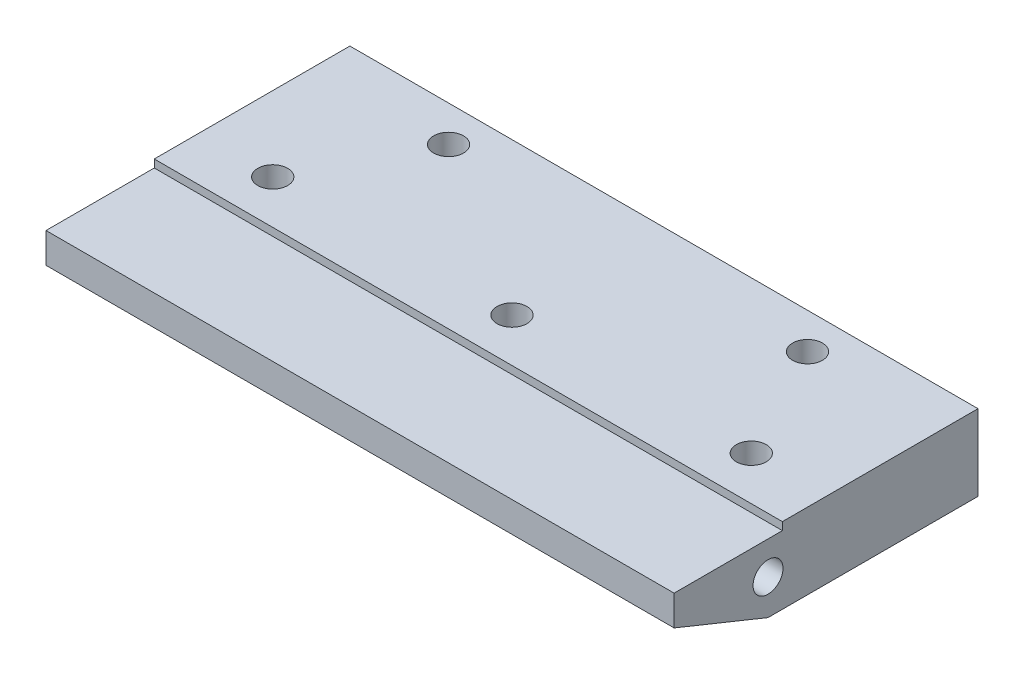
ISO-10303-21;
HEADER;
FILE_DESCRIPTION(('STEP AP214'),'2;1');
FILE_NAME('part.step','',(''),(''),'','','');
FILE_SCHEMA(('AUTOMOTIVE_DESIGN { 1 0 10303 214 1 1 1 1 }'));
ENDSEC;
DATA;
#1=APPLICATION_CONTEXT('core data for automotive mechanical design processes');
#2=APPLICATION_PROTOCOL_DEFINITION('international standard','automotive_design',2000,#1);
#3=PRODUCT_CONTEXT('',#1,'mechanical');
#4=PRODUCT('Part','Part','',(#3));
#5=PRODUCT_RELATED_PRODUCT_CATEGORY('part','',(#4));
#6=PRODUCT_DEFINITION_FORMATION('','',#4);
#7=PRODUCT_DEFINITION_CONTEXT('part definition',#1,'design');
#8=PRODUCT_DEFINITION('design','',#6,#7);
#9=PRODUCT_DEFINITION_SHAPE('','',#8);
#10=(LENGTH_UNIT() NAMED_UNIT(*) SI_UNIT(.MILLI.,.METRE.));
#11=(NAMED_UNIT(*) PLANE_ANGLE_UNIT() SI_UNIT($,.RADIAN.));
#12=(NAMED_UNIT(*) SI_UNIT($,.STERADIAN.) SOLID_ANGLE_UNIT());
#13=UNCERTAINTY_MEASURE_WITH_UNIT(LENGTH_MEASURE(1.E-05),#10,'distance_accuracy_value','');
#14=(GEOMETRIC_REPRESENTATION_CONTEXT(3) GLOBAL_UNCERTAINTY_ASSIGNED_CONTEXT((#13)) GLOBAL_UNIT_ASSIGNED_CONTEXT((#10,
#11,#12)) REPRESENTATION_CONTEXT('',''));
#15=CARTESIAN_POINT('',(0.,0.,0.));
#16=DIRECTION('',(0.,0.,1.));
#17=DIRECTION('',(1.,0.,0.));
#18=AXIS2_PLACEMENT_3D('',#15,#16,#17);
#19=CARTESIAN_POINT('',(-52.5,12.7,25.4));
#20=DIRECTION('',(1.,0.,0.));
#21=DIRECTION('',(0.,0.,-1.));
#22=AXIS2_PLACEMENT_3D('',#19,#20,#21);
#23=PLANE('',#22);
#24=CARTESIAN_POINT('',(-52.5,5.89001188077765,9.7010314887358));
#25=DIRECTION('',(1.,0.,0.));
#26=DIRECTION('',(0.,0.,-1.));
#27=AXIS2_PLACEMENT_3D('',#24,#25,#26);
#28=CIRCLE('',#27,2.5);
#29=CARTESIAN_POINT('',(-52.5,5.89001188077765,7.2010314887358));
#30=VERTEX_POINT('',#29);
#31=EDGE_CURVE('E200',#30,#30,#28,.T.);
#32=ORIENTED_EDGE('',*,*,#31,.T.);
#33=EDGE_LOOP('',(#32));
#34=FACE_BOUND('',#33,.T.);
#35=DIRECTION('',(0.,0.,-1.));
#36=VECTOR('',#35,1.);
#37=CARTESIAN_POINT('',(-52.5,11.394536374143,25.4));
#38=LINE('',#37,#36);
#39=CARTESIAN_POINT('',(-52.5,11.394536374143,25.4));
#40=VERTEX_POINT('',#39);
#41=CARTESIAN_POINT('',(-52.5,11.394536374143,7.3022309751575));
#42=VERTEX_POINT('',#41);
#43=EDGE_CURVE('E90',#40,#42,#38,.T.);
#44=ORIENTED_EDGE('',*,*,#43,.T.);
#45=DIRECTION('',(0.,1.,0.));
#46=VECTOR('',#45,1.);
#47=CARTESIAN_POINT('',(-52.5,12.7,7.3022309751575));
#48=LINE('',#47,#46);
#49=CARTESIAN_POINT('',(-52.5,12.7,7.3022309751575));
#50=VERTEX_POINT('',#49);
#51=EDGE_CURVE('E101',#42,#50,#48,.T.);
#52=ORIENTED_EDGE('',*,*,#51,.T.);
#53=DIRECTION('',(0.,0.,1.));
#54=VECTOR('',#53,1.);
#55=CARTESIAN_POINT('',(-52.5,12.7,25.4));
#56=LINE('',#55,#54);
#57=CARTESIAN_POINT('',(-52.5,12.7,-25.4));
#58=VERTEX_POINT('',#57);
#59=EDGE_CURVE('E123',#58,#50,#56,.T.);
#60=ORIENTED_EDGE('',*,*,#59,.F.);
#61=DIRECTION('',(0.,-1.,0.));
#62=VECTOR('',#61,1.);
#63=CARTESIAN_POINT('',(-52.5,12.7,-25.4));
#64=LINE('',#63,#62);
#65=CARTESIAN_POINT('',(-52.5,0.,-25.4));
#66=VERTEX_POINT('',#65);
#67=EDGE_CURVE('E131',#58,#66,#64,.T.);
#68=ORIENTED_EDGE('',*,*,#67,.T.);
#69=DIRECTION('',(0.,0.,1.));
#70=VECTOR('',#69,1.);
#71=CARTESIAN_POINT('',(-52.5,0.,25.4));
#72=LINE('',#71,#70);
#73=CARTESIAN_POINT('',(-52.5,0.,9.7010314887358));
#74=VERTEX_POINT('',#73);
#75=EDGE_CURVE('E111',#66,#74,#72,.T.);
#76=ORIENTED_EDGE('',*,*,#75,.T.);
#77=DIRECTION('',(0.,0.374972320189401,0.927036007440799));
#78=VECTOR('',#77,1.);
#79=CARTESIAN_POINT('',(-52.5,6.35,25.4));
#80=LINE('',#79,#78);
#81=CARTESIAN_POINT('',(-52.5,6.35,25.4));
#82=VERTEX_POINT('',#81);
#83=EDGE_CURVE('E55',#74,#82,#80,.T.);
#84=ORIENTED_EDGE('',*,*,#83,.T.);
#85=DIRECTION('',(0.,-1.,0.));
#86=VECTOR('',#85,1.);
#87=CARTESIAN_POINT('',(-52.5,12.7,25.4));
#88=LINE('',#87,#86);
#89=EDGE_CURVE('E11',#40,#82,#88,.T.);
#90=ORIENTED_EDGE('',*,*,#89,.F.);
#91=EDGE_LOOP('',(#44,#52,#60,#68,#76,#84,#90));
#92=FACE_BOUND('',#91,.T.);
#93=ADVANCED_FACE('F33',(#34,#92),#23,.F.);
#94=CARTESIAN_POINT('',(52.5,12.7,25.4));
#95=DIRECTION('',(0.,0.,-1.));
#96=DIRECTION('',(-1.,0.,0.));
#97=AXIS2_PLACEMENT_3D('',#94,#95,#96);
#98=PLANE('',#97);
#99=DIRECTION('',(0.,-1.,0.));
#100=VECTOR('',#99,1.);
#101=CARTESIAN_POINT('',(52.5,12.7,25.4));
#102=LINE('',#101,#100);
#103=CARTESIAN_POINT('',(52.5,11.394536374143,25.4));
#104=VERTEX_POINT('',#103);
#105=CARTESIAN_POINT('',(52.5,6.35,25.4));
#106=VERTEX_POINT('',#105);
#107=EDGE_CURVE('E40',#104,#106,#102,.T.);
#108=ORIENTED_EDGE('',*,*,#107,.F.);
#109=DIRECTION('',(1.,0.,0.));
#110=VECTOR('',#109,1.);
#111=CARTESIAN_POINT('',(-52.5,11.394536374143,25.4));
#112=LINE('',#111,#110);
#113=EDGE_CURVE('E94',#40,#104,#112,.T.);
#114=ORIENTED_EDGE('',*,*,#113,.F.);
#115=ORIENTED_EDGE('',*,*,#89,.T.);
#116=DIRECTION('',(1.,0.,0.));
#117=VECTOR('',#116,1.);
#118=CARTESIAN_POINT('',(-52.5,6.35,25.4));
#119=LINE('',#118,#117);
#120=EDGE_CURVE('E115',#82,#106,#119,.T.);
#121=ORIENTED_EDGE('',*,*,#120,.T.);
#122=EDGE_LOOP('',(#108,#114,#115,#121));
#123=FACE_BOUND('',#122,.T.);
#124=ADVANCED_FACE('F105',(#123),#98,.F.);
#125=CARTESIAN_POINT('',(52.5,12.7,25.4));
#126=DIRECTION('',(-1.,0.,0.));
#127=DIRECTION('',(0.,0.,1.));
#128=AXIS2_PLACEMENT_3D('',#125,#126,#127);
#129=PLANE('',#128);
#130=CARTESIAN_POINT('',(52.5,5.89001188077765,9.7010314887358));
#131=DIRECTION('',(1.,0.,0.));
#132=DIRECTION('',(0.,0.,-1.));
#133=AXIS2_PLACEMENT_3D('',#130,#131,#132);
#134=CIRCLE('',#133,2.5);
#135=CARTESIAN_POINT('',(52.5,5.89001188077765,7.2010314887358));
#136=VERTEX_POINT('',#135);
#137=EDGE_CURVE('E194',#136,#136,#134,.T.);
#138=ORIENTED_EDGE('',*,*,#137,.F.);
#139=EDGE_LOOP('',(#138));
#140=FACE_BOUND('',#139,.T.);
#141=DIRECTION('',(0.,0.,-1.));
#142=VECTOR('',#141,1.);
#143=CARTESIAN_POINT('',(52.5,12.7,25.4));
#144=LINE('',#143,#142);
#145=CARTESIAN_POINT('',(52.5,12.7,7.3022309751575));
#146=VERTEX_POINT('',#145);
#147=CARTESIAN_POINT('',(52.5,12.7,-25.4));
#148=VERTEX_POINT('',#147);
#149=EDGE_CURVE('E126',#146,#148,#144,.T.);
#150=ORIENTED_EDGE('',*,*,#149,.F.);
#151=DIRECTION('',(0.,1.,0.));
#152=VECTOR('',#151,1.);
#153=CARTESIAN_POINT('',(52.5,12.7,7.3022309751575));
#154=LINE('',#153,#152);
#155=CARTESIAN_POINT('',(52.5,11.394536374143,7.3022309751575));
#156=VERTEX_POINT('',#155);
#157=EDGE_CURVE('E47',#156,#146,#154,.T.);
#158=ORIENTED_EDGE('',*,*,#157,.F.);
#159=DIRECTION('',(0.,0.,-1.));
#160=VECTOR('',#159,1.);
#161=CARTESIAN_POINT('',(52.5,11.394536374143,25.4));
#162=LINE('',#161,#160);
#163=EDGE_CURVE('E144',#104,#156,#162,.T.);
#164=ORIENTED_EDGE('',*,*,#163,.F.);
#165=ORIENTED_EDGE('',*,*,#107,.T.);
#166=DIRECTION('',(0.,0.374972320189401,0.927036007440799));
#167=VECTOR('',#166,1.);
#168=CARTESIAN_POINT('',(52.5,6.35,25.4));
#169=LINE('',#168,#167);
#170=CARTESIAN_POINT('',(52.5,0.,9.7010314887358));
#171=VERTEX_POINT('',#170);
#172=EDGE_CURVE('E113',#171,#106,#169,.T.);
#173=ORIENTED_EDGE('',*,*,#172,.F.);
#174=DIRECTION('',(0.,0.,-1.));
#175=VECTOR('',#174,1.);
#176=CARTESIAN_POINT('',(52.5,0.,25.4));
#177=LINE('',#176,#175);
#178=CARTESIAN_POINT('',(52.5,0.,-25.4));
#179=VERTEX_POINT('',#178);
#180=EDGE_CURVE('E133',#171,#179,#177,.T.);
#181=ORIENTED_EDGE('',*,*,#180,.T.);
#182=DIRECTION('',(0.,-1.,0.));
#183=VECTOR('',#182,1.);
#184=CARTESIAN_POINT('',(52.5,12.7,-25.4));
#185=LINE('',#184,#183);
#186=EDGE_CURVE('E137',#148,#179,#185,.T.);
#187=ORIENTED_EDGE('',*,*,#186,.F.);
#188=EDGE_LOOP('',(#150,#158,#164,#165,#173,#181,#187));
#189=FACE_BOUND('',#188,.T.);
#190=ADVANCED_FACE('F142',(#140,#189),#129,.F.);
#191=CARTESIAN_POINT('',(52.5,12.7,-25.4));
#192=DIRECTION('',(0.,0.,1.));
#193=DIRECTION('',(1.,0.,0.));
#194=AXIS2_PLACEMENT_3D('',#191,#192,#193);
#195=PLANE('',#194);
#196=DIRECTION('',(-1.,0.,0.));
#197=VECTOR('',#196,1.);
#198=CARTESIAN_POINT('',(52.5,0.,-25.4));
#199=LINE('',#198,#197);
#200=EDGE_CURVE('E127',#179,#66,#199,.T.);
#201=ORIENTED_EDGE('',*,*,#200,.T.);
#202=ORIENTED_EDGE('',*,*,#67,.F.);
#203=DIRECTION('',(-1.,0.,0.));
#204=VECTOR('',#203,1.);
#205=CARTESIAN_POINT('',(52.5,12.7,-25.4));
#206=LINE('',#205,#204);
#207=EDGE_CURVE('E129',#148,#58,#206,.T.);
#208=ORIENTED_EDGE('',*,*,#207,.F.);
#209=ORIENTED_EDGE('',*,*,#186,.T.);
#210=EDGE_LOOP('',(#201,#202,#208,#209));
#211=FACE_BOUND('',#210,.T.);
#212=ADVANCED_FACE('F152',(#211),#195,.F.);
#213=CARTESIAN_POINT('',(0.,12.7,0.));
#214=DIRECTION('',(0.,1.,0.));
#215=DIRECTION('',(0.,0.,1.));
#216=AXIS2_PLACEMENT_3D('',#213,#214,#215);
#217=PLANE('',#216);
#218=CARTESIAN_POINT('',(30.,12.7,-19.4));
#219=DIRECTION('',(0.,1.,0.));
#220=DIRECTION('',(0.,0.,1.));
#221=AXIS2_PLACEMENT_3D('',#218,#219,#220);
#222=CIRCLE('',#221,2.49999999999999);
#223=CARTESIAN_POINT('',(30.,12.7,-16.9));
#224=VERTEX_POINT('',#223);
#225=EDGE_CURVE('E188',#224,#224,#222,.T.);
#226=ORIENTED_EDGE('',*,*,#225,.F.);
#227=EDGE_LOOP('',(#226));
#228=FACE_BOUND('',#227,.T.);
#229=CARTESIAN_POINT('',(-30.,12.7,-19.4));
#230=DIRECTION('',(0.,1.,0.));
#231=DIRECTION('',(0.,0.,1.));
#232=AXIS2_PLACEMENT_3D('',#229,#230,#231);
#233=CIRCLE('',#232,2.5);
#234=CARTESIAN_POINT('',(-30.,12.7,-16.9));
#235=VERTEX_POINT('',#234);
#236=EDGE_CURVE('E182',#235,#235,#233,.T.);
#237=ORIENTED_EDGE('',*,*,#236,.F.);
#238=EDGE_LOOP('',(#237));
#239=FACE_BOUND('',#238,.T.);
#240=CARTESIAN_POINT('',(-40.,12.7,0.));
#241=DIRECTION('',(0.,1.,0.));
#242=DIRECTION('',(0.,0.,1.));
#243=AXIS2_PLACEMENT_3D('',#240,#241,#242);
#244=CIRCLE('',#243,2.5);
#245=CARTESIAN_POINT('',(-40.,12.7,2.5));
#246=VERTEX_POINT('',#245);
#247=EDGE_CURVE('E177',#246,#246,#244,.T.);
#248=ORIENTED_EDGE('',*,*,#247,.F.);
#249=EDGE_LOOP('',(#248));
#250=FACE_BOUND('',#249,.T.);
#251=CARTESIAN_POINT('',(40.,12.7,0.));
#252=DIRECTION('',(0.,1.,0.));
#253=DIRECTION('',(0.,0.,1.));
#254=AXIS2_PLACEMENT_3D('',#251,#252,#253);
#255=CIRCLE('',#254,2.5);
#256=CARTESIAN_POINT('',(40.,12.7,2.5));
#257=VERTEX_POINT('',#256);
#258=EDGE_CURVE('E170',#257,#257,#255,.T.);
#259=ORIENTED_EDGE('',*,*,#258,.F.);
#260=EDGE_LOOP('',(#259));
#261=FACE_BOUND('',#260,.T.);
#262=CARTESIAN_POINT('',(0.,12.7,0.));
#263=DIRECTION('',(0.,1.,0.));
#264=DIRECTION('',(0.,0.,1.));
#265=AXIS2_PLACEMENT_3D('',#262,#263,#264);
#266=CIRCLE('',#265,2.5);
#267=CARTESIAN_POINT('',(0.,12.7,2.5));
#268=VERTEX_POINT('',#267);
#269=EDGE_CURVE('E164',#268,#268,#266,.T.);
#270=ORIENTED_EDGE('',*,*,#269,.F.);
#271=EDGE_LOOP('',(#270));
#272=FACE_BOUND('',#271,.T.);
#273=DIRECTION('',(1.,0.,0.));
#274=VECTOR('',#273,1.);
#275=CARTESIAN_POINT('',(-52.5,12.7,7.3022309751575));
#276=LINE('',#275,#274);
#277=EDGE_CURVE('E118',#50,#146,#276,.T.);
#278=ORIENTED_EDGE('',*,*,#277,.T.);
#279=ORIENTED_EDGE('',*,*,#149,.T.);
#280=ORIENTED_EDGE('',*,*,#207,.T.);
#281=ORIENTED_EDGE('',*,*,#59,.T.);
#282=EDGE_LOOP('',(#278,#279,#280,#281));
#283=FACE_BOUND('',#282,.T.);
#284=ADVANCED_FACE('F156',(#228,#239,#250,#261,#272,#283),#217,.T.);
#285=CARTESIAN_POINT('',(0.,0.,0.));
#286=DIRECTION('',(0.,1.,0.));
#287=DIRECTION('',(0.,0.,1.));
#288=AXIS2_PLACEMENT_3D('',#285,#286,#287);
#289=PLANE('',#288);
#290=CARTESIAN_POINT('',(30.,0.,-19.4));
#291=DIRECTION('',(0.,1.,0.));
#292=DIRECTION('',(0.,0.,1.));
#293=AXIS2_PLACEMENT_3D('',#290,#291,#292);
#294=CIRCLE('',#293,2.49999999999999);
#295=CARTESIAN_POINT('',(30.,0.,-16.9));
#296=VERTEX_POINT('',#295);
#297=EDGE_CURVE('E185',#296,#296,#294,.T.);
#298=ORIENTED_EDGE('',*,*,#297,.T.);
#299=EDGE_LOOP('',(#298));
#300=FACE_BOUND('',#299,.T.);
#301=CARTESIAN_POINT('',(-30.,0.,-19.4));
#302=DIRECTION('',(0.,1.,0.));
#303=DIRECTION('',(0.,0.,1.));
#304=AXIS2_PLACEMENT_3D('',#301,#302,#303);
#305=CIRCLE('',#304,2.5);
#306=CARTESIAN_POINT('',(-30.,0.,-16.9));
#307=VERTEX_POINT('',#306);
#308=EDGE_CURVE('E174',#307,#307,#305,.T.);
#309=ORIENTED_EDGE('',*,*,#308,.T.);
#310=EDGE_LOOP('',(#309));
#311=FACE_BOUND('',#310,.T.);
#312=CARTESIAN_POINT('',(-40.,0.,0.));
#313=DIRECTION('',(0.,1.,0.));
#314=DIRECTION('',(0.,0.,1.));
#315=AXIS2_PLACEMENT_3D('',#312,#313,#314);
#316=CIRCLE('',#315,2.5);
#317=CARTESIAN_POINT('',(-40.,0.,2.5));
#318=VERTEX_POINT('',#317);
#319=EDGE_CURVE('E167',#318,#318,#316,.T.);
#320=ORIENTED_EDGE('',*,*,#319,.T.);
#321=EDGE_LOOP('',(#320));
#322=FACE_BOUND('',#321,.T.);
#323=CARTESIAN_POINT('',(40.,0.,0.));
#324=DIRECTION('',(0.,1.,0.));
#325=DIRECTION('',(0.,0.,1.));
#326=AXIS2_PLACEMENT_3D('',#323,#324,#325);
#327=CIRCLE('',#326,2.5);
#328=CARTESIAN_POINT('',(40.,0.,2.5));
#329=VERTEX_POINT('',#328);
#330=EDGE_CURVE('E173',#329,#329,#327,.T.);
#331=ORIENTED_EDGE('',*,*,#330,.T.);
#332=EDGE_LOOP('',(#331));
#333=FACE_BOUND('',#332,.T.);
#334=CARTESIAN_POINT('',(0.,0.,0.));
#335=DIRECTION('',(0.,1.,0.));
#336=DIRECTION('',(0.,0.,1.));
#337=AXIS2_PLACEMENT_3D('',#334,#335,#336);
#338=CIRCLE('',#337,2.5);
#339=CARTESIAN_POINT('',(0.,0.,2.5));
#340=VERTEX_POINT('',#339);
#341=EDGE_CURVE('E158',#340,#340,#338,.T.);
#342=ORIENTED_EDGE('',*,*,#341,.T.);
#343=EDGE_LOOP('',(#342));
#344=FACE_BOUND('',#343,.T.);
#345=ORIENTED_EDGE('',*,*,#180,.F.);
#346=DIRECTION('',(1.,0.,0.));
#347=VECTOR('',#346,1.);
#348=CARTESIAN_POINT('',(-52.5,0.,9.7010314887358));
#349=LINE('',#348,#347);
#350=EDGE_CURVE('E112',#74,#171,#349,.T.);
#351=ORIENTED_EDGE('',*,*,#350,.F.);
#352=ORIENTED_EDGE('',*,*,#75,.F.);
#353=ORIENTED_EDGE('',*,*,#200,.F.);
#354=EDGE_LOOP('',(#345,#351,#352,#353));
#355=FACE_BOUND('',#354,.T.);
#356=ADVANCED_FACE('F147',(#300,#311,#322,#333,#344,#355),#289,.F.);
#357=CARTESIAN_POINT('',(-52.5,6.35,25.4));
#358=DIRECTION('',(0.,0.927036007440799,-0.374972320189401));
#359=DIRECTION('',(0.,0.374972320189401,0.927036007440799));
#360=AXIS2_PLACEMENT_3D('',#357,#358,#359);
#361=PLANE('',#360);
#362=ORIENTED_EDGE('',*,*,#172,.T.);
#363=ORIENTED_EDGE('',*,*,#120,.F.);
#364=ORIENTED_EDGE('',*,*,#83,.F.);
#365=ORIENTED_EDGE('',*,*,#350,.T.);
#366=EDGE_LOOP('',(#362,#363,#364,#365));
#367=FACE_BOUND('',#366,.T.);
#368=ADVANCED_FACE('F145',(#367),#361,.F.);
#369=CARTESIAN_POINT('',(-52.5,12.7,7.3022309751575));
#370=DIRECTION('',(0.,0.,-1.));
#371=DIRECTION('',(-1.,0.,0.));
#372=AXIS2_PLACEMENT_3D('',#369,#370,#371);
#373=PLANE('',#372);
#374=ORIENTED_EDGE('',*,*,#157,.T.);
#375=ORIENTED_EDGE('',*,*,#277,.F.);
#376=ORIENTED_EDGE('',*,*,#51,.F.);
#377=DIRECTION('',(1.,0.,0.));
#378=VECTOR('',#377,1.);
#379=CARTESIAN_POINT('',(-52.5,11.394536374143,7.3022309751575));
#380=LINE('',#379,#378);
#381=EDGE_CURVE('E96',#42,#156,#380,.T.);
#382=ORIENTED_EDGE('',*,*,#381,.T.);
#383=EDGE_LOOP('',(#374,#375,#376,#382));
#384=FACE_BOUND('',#383,.T.);
#385=ADVANCED_FACE('F162',(#384),#373,.F.);
#386=CARTESIAN_POINT('',(-52.5,11.394536374143,25.4));
#387=DIRECTION('',(0.,-1.,0.));
#388=DIRECTION('',(0.,0.,-1.));
#389=AXIS2_PLACEMENT_3D('',#386,#387,#388);
#390=PLANE('',#389);
#391=ORIENTED_EDGE('',*,*,#163,.T.);
#392=ORIENTED_EDGE('',*,*,#381,.F.);
#393=ORIENTED_EDGE('',*,*,#43,.F.);
#394=ORIENTED_EDGE('',*,*,#113,.T.);
#395=EDGE_LOOP('',(#391,#392,#393,#394));
#396=FACE_BOUND('',#395,.T.);
#397=ADVANCED_FACE('F93',(#396),#390,.F.);
#398=CARTESIAN_POINT('',(0.,0.,0.));
#399=DIRECTION('',(0.,1.,0.));
#400=DIRECTION('',(0.,0.,1.));
#401=AXIS2_PLACEMENT_3D('',#398,#399,#400);
#402=CYLINDRICAL_SURFACE('',#401,2.5);
#403=ORIENTED_EDGE('',*,*,#341,.F.);
#404=EDGE_LOOP('',(#403));
#405=FACE_BOUND('',#404,.T.);
#406=ORIENTED_EDGE('',*,*,#269,.T.);
#407=EDGE_LOOP('',(#406));
#408=FACE_BOUND('',#407,.T.);
#409=ADVANCED_FACE('F241',(#405,#408),#402,.F.);
#410=CARTESIAN_POINT('',(40.,0.,0.));
#411=DIRECTION('',(0.,1.,0.));
#412=DIRECTION('',(0.,0.,1.));
#413=AXIS2_PLACEMENT_3D('',#410,#411,#412);
#414=CYLINDRICAL_SURFACE('',#413,2.5);
#415=ORIENTED_EDGE('',*,*,#330,.F.);
#416=EDGE_LOOP('',(#415));
#417=FACE_BOUND('',#416,.T.);
#418=ORIENTED_EDGE('',*,*,#258,.T.);
#419=EDGE_LOOP('',(#418));
#420=FACE_BOUND('',#419,.T.);
#421=ADVANCED_FACE('F246',(#417,#420),#414,.F.);
#422=CARTESIAN_POINT('',(-40.,0.,0.));
#423=DIRECTION('',(0.,1.,0.));
#424=DIRECTION('',(0.,0.,1.));
#425=AXIS2_PLACEMENT_3D('',#422,#423,#424);
#426=CYLINDRICAL_SURFACE('',#425,2.5);
#427=ORIENTED_EDGE('',*,*,#319,.F.);
#428=EDGE_LOOP('',(#427));
#429=FACE_BOUND('',#428,.T.);
#430=ORIENTED_EDGE('',*,*,#247,.T.);
#431=EDGE_LOOP('',(#430));
#432=FACE_BOUND('',#431,.T.);
#433=ADVANCED_FACE('F250',(#429,#432),#426,.F.);
#434=CARTESIAN_POINT('',(-30.,0.,-19.4));
#435=DIRECTION('',(0.,1.,0.));
#436=DIRECTION('',(0.,0.,1.));
#437=AXIS2_PLACEMENT_3D('',#434,#435,#436);
#438=CYLINDRICAL_SURFACE('',#437,2.5);
#439=ORIENTED_EDGE('',*,*,#308,.F.);
#440=EDGE_LOOP('',(#439));
#441=FACE_BOUND('',#440,.T.);
#442=ORIENTED_EDGE('',*,*,#236,.T.);
#443=EDGE_LOOP('',(#442));
#444=FACE_BOUND('',#443,.T.);
#445=ADVANCED_FACE('F254',(#441,#444),#438,.F.);
#446=CARTESIAN_POINT('',(30.,0.,-19.4));
#447=DIRECTION('',(0.,1.,0.));
#448=DIRECTION('',(0.,0.,1.));
#449=AXIS2_PLACEMENT_3D('',#446,#447,#448);
#450=CYLINDRICAL_SURFACE('',#449,2.49999999999999);
#451=ORIENTED_EDGE('',*,*,#297,.F.);
#452=EDGE_LOOP('',(#451));
#453=FACE_BOUND('',#452,.T.);
#454=ORIENTED_EDGE('',*,*,#225,.T.);
#455=EDGE_LOOP('',(#454));
#456=FACE_BOUND('',#455,.T.);
#457=ADVANCED_FACE('F258',(#453,#456),#450,.F.);
#458=CARTESIAN_POINT('',(40.5,5.89001188077765,9.7010314887358));
#459=DIRECTION('',(1.,0.,0.));
#460=DIRECTION('',(0.,0.,-1.));
#461=AXIS2_PLACEMENT_3D('',#458,#459,#460);
#462=CYLINDRICAL_SURFACE('',#461,2.5);
#463=CARTESIAN_POINT('',(40.5,5.89001188077765,9.7010314887358));
#464=DIRECTION('',(1.,0.,0.));
#465=DIRECTION('',(0.,0.,-1.));
#466=AXIS2_PLACEMENT_3D('',#463,#464,#465);
#467=CIRCLE('',#466,2.5);
#468=CARTESIAN_POINT('',(40.5,5.89001188077765,7.2010314887358));
#469=VERTEX_POINT('',#468);
#470=EDGE_CURVE('E191',#469,#469,#467,.T.);
#471=ORIENTED_EDGE('',*,*,#470,.F.);
#472=EDGE_LOOP('',(#471));
#473=FACE_BOUND('',#472,.T.);
#474=ORIENTED_EDGE('',*,*,#137,.T.);
#475=EDGE_LOOP('',(#474));
#476=FACE_BOUND('',#475,.T.);
#477=ADVANCED_FACE('F262',(#473,#476),#462,.F.);
#478=CARTESIAN_POINT('',(40.5,5.89001188077765,9.7010314887358));
#479=DIRECTION('',(1.,0.,0.));
#480=DIRECTION('',(0.,0.,-1.));
#481=AXIS2_PLACEMENT_3D('',#478,#479,#480);
#482=PLANE('',#481);
#483=ORIENTED_EDGE('',*,*,#470,.T.);
#484=EDGE_LOOP('',(#483));
#485=FACE_BOUND('',#484,.T.);
#486=ADVANCED_FACE('F215',(#485),#482,.T.);
#487=CARTESIAN_POINT('',(-40.5,5.89001188077765,9.7010314887358));
#488=DIRECTION('',(-1.,0.,0.));
#489=DIRECTION('',(0.,0.,1.));
#490=AXIS2_PLACEMENT_3D('',#487,#488,#489);
#491=CYLINDRICAL_SURFACE('',#490,2.5);
#492=CARTESIAN_POINT('',(-40.5,5.89001188077765,9.7010314887358));
#493=DIRECTION('',(1.,0.,0.));
#494=DIRECTION('',(0.,0.,-1.));
#495=AXIS2_PLACEMENT_3D('',#492,#493,#494);
#496=CIRCLE('',#495,2.5);
#497=CARTESIAN_POINT('',(-40.5,5.89001188077765,7.2010314887358));
#498=VERTEX_POINT('',#497);
#499=EDGE_CURVE('E197',#498,#498,#496,.T.);
#500=ORIENTED_EDGE('',*,*,#499,.T.);
#501=EDGE_LOOP('',(#500));
#502=FACE_BOUND('',#501,.T.);
#503=ORIENTED_EDGE('',*,*,#31,.F.);
#504=EDGE_LOOP('',(#503));
#505=FACE_BOUND('',#504,.T.);
#506=ADVANCED_FACE('F206',(#502,#505),#491,.F.);
#507=CARTESIAN_POINT('',(-40.5,5.89001188077765,9.7010314887358));
#508=DIRECTION('',(-1.,0.,0.));
#509=DIRECTION('',(0.,0.,-1.));
#510=AXIS2_PLACEMENT_3D('',#507,#508,#509);
#511=PLANE('',#510);
#512=ORIENTED_EDGE('',*,*,#499,.F.);
#513=EDGE_LOOP('',(#512));
#514=FACE_BOUND('',#513,.T.);
#515=ADVANCED_FACE('F209',(#514),#511,.T.);
#516=CLOSED_SHELL('',(#93,#124,#190,#212,#284,#356,#368,#385,#397,#409,#421,#433,#445,#457,#477,
#486,#506,#515));
#517=MANIFOLD_SOLID_BREP('B2',#516);
#518=ADVANCED_BREP_SHAPE_REPRESENTATION('',(#18,#517),#14);
#519=SHAPE_DEFINITION_REPRESENTATION(#9,#518);
ENDSEC;
END-ISO-10303-21;
